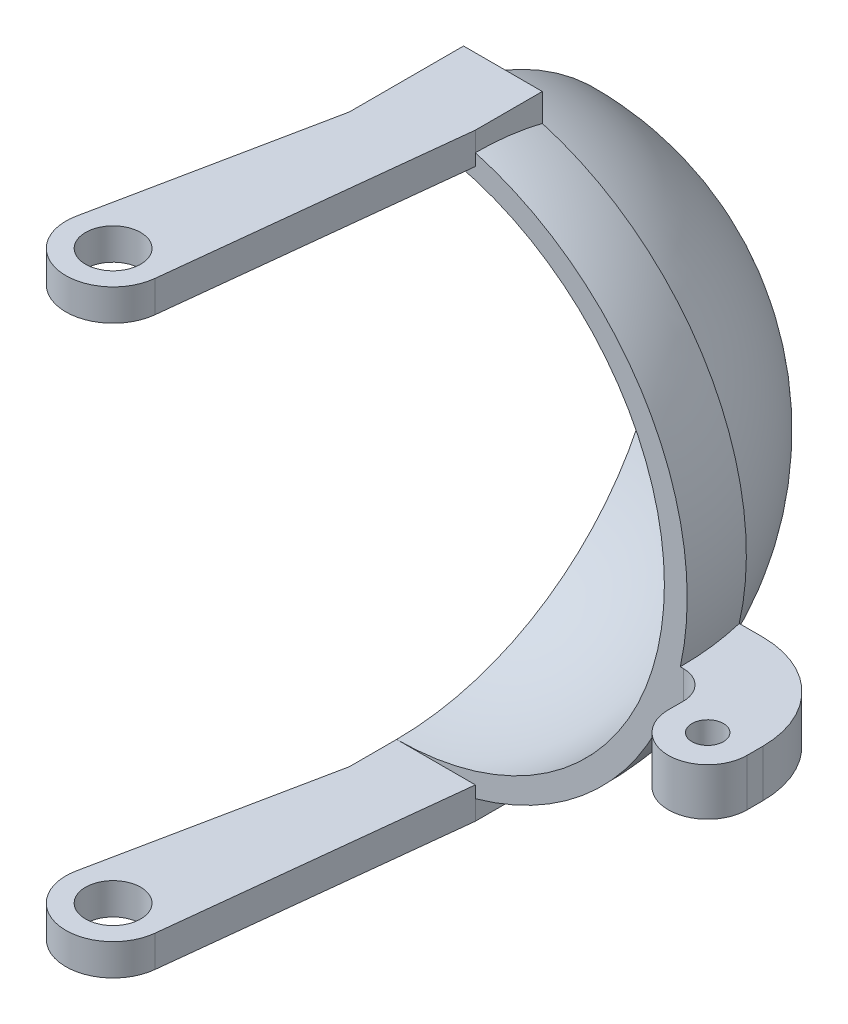
ISO-10303-21;
HEADER;
FILE_DESCRIPTION(('STEP AP214'),'2;1');
FILE_NAME('part.step','',(''),(''),'','','');
FILE_SCHEMA(('AUTOMOTIVE_DESIGN { 1 0 10303 214 1 1 1 1 }'));
ENDSEC;
DATA;
#1=APPLICATION_CONTEXT('core data for automotive mechanical design processes');
#2=APPLICATION_PROTOCOL_DEFINITION('international standard','automotive_design',2000,#1);
#3=PRODUCT_CONTEXT('',#1,'mechanical');
#4=PRODUCT('Part','Part','',(#3));
#5=PRODUCT_RELATED_PRODUCT_CATEGORY('part','',(#4));
#6=PRODUCT_DEFINITION_FORMATION('','',#4);
#7=PRODUCT_DEFINITION_CONTEXT('part definition',#1,'design');
#8=PRODUCT_DEFINITION('design','',#6,#7);
#9=PRODUCT_DEFINITION_SHAPE('','',#8);
#10=(LENGTH_UNIT() NAMED_UNIT(*) SI_UNIT(.MILLI.,.METRE.));
#11=(NAMED_UNIT(*) PLANE_ANGLE_UNIT() SI_UNIT($,.RADIAN.));
#12=(NAMED_UNIT(*) SI_UNIT($,.STERADIAN.) SOLID_ANGLE_UNIT());
#13=UNCERTAINTY_MEASURE_WITH_UNIT(LENGTH_MEASURE(1.E-05),#10,'distance_accuracy_value','');
#14=(GEOMETRIC_REPRESENTATION_CONTEXT(3) GLOBAL_UNCERTAINTY_ASSIGNED_CONTEXT((#13)) GLOBAL_UNIT_ASSIGNED_CONTEXT((#10,
#11,#12)) REPRESENTATION_CONTEXT('',''));
#15=CARTESIAN_POINT('',(0.,0.,0.));
#16=DIRECTION('',(0.,0.,1.));
#17=DIRECTION('',(1.,0.,0.));
#18=AXIS2_PLACEMENT_3D('',#15,#16,#17);
#19=CARTESIAN_POINT('',(0.,0.,0.));
#20=DIRECTION('',(0.,0.,1.));
#21=DIRECTION('',(0.,-1.,0.));
#22=AXIS2_PLACEMENT_3D('',#19,#20,#21);
#23=SPHERICAL_SURFACE('',#22,18.45);
#24=CARTESIAN_POINT('',(0.,0.,-4.25));
#25=DIRECTION('',(0.,0.,1.));
#26=DIRECTION('',(1.,0.,0.));
#27=AXIS2_PLACEMENT_3D('',#24,#25,#26);
#28=CIRCLE('',#27,17.9538296750303);
#29=CARTESIAN_POINT('',(5.,-17.2435495185881,-4.25));
#30=VERTEX_POINT('',#29);
#31=CARTESIAN_POINT('',(16.5329973084133,-7.,-4.25));
#32=VERTEX_POINT('',#31);
#33=EDGE_CURVE('E365',#30,#32,#28,.T.);
#34=ORIENTED_EDGE('',*,*,#33,.T.);
#35=CARTESIAN_POINT('',(0.,-7.,0.));
#36=DIRECTION('',(0.,-1.,0.));
#37=DIRECTION('',(0.,0.,-1.));
#38=AXIS2_PLACEMENT_3D('',#35,#36,#37);
#39=CIRCLE('',#38,17.0705155165273);
#40=CARTESIAN_POINT('',(17.0705155165273,-7.,0.));
#41=VERTEX_POINT('',#40);
#42=EDGE_CURVE('E238',#41,#32,#39,.F.);
#43=ORIENTED_EDGE('',*,*,#42,.F.);
#44=CARTESIAN_POINT('',(0.,0.,0.));
#45=DIRECTION('',(0.,0.,1.));
#46=DIRECTION('',(1.,0.,0.));
#47=AXIS2_PLACEMENT_3D('',#44,#45,#46);
#48=CIRCLE('',#47,18.45);
#49=CARTESIAN_POINT('',(5.,-17.7595748822994,0.));
#50=VERTEX_POINT('',#49);
#51=EDGE_CURVE('E371',#50,#41,#48,.T.);
#52=ORIENTED_EDGE('',*,*,#51,.F.);
#53=CARTESIAN_POINT('',(5.,0.,0.));
#54=DIRECTION('',(-1.,0.,0.));
#55=DIRECTION('',(0.,0.,1.));
#56=AXIS2_PLACEMENT_3D('',#53,#54,#55);
#57=CIRCLE('',#56,17.7595748822994);
#58=EDGE_CURVE('E348',#50,#30,#57,.F.);
#59=ORIENTED_EDGE('',*,*,#58,.T.);
#60=EDGE_LOOP('',(#34,#43,#52,#59));
#61=FACE_BOUND('',#60,.T.);
#62=ADVANCED_FACE('F43',(#61),#23,.T.);
#63=CARTESIAN_POINT('',(0.,0.,0.));
#64=DIRECTION('',(0.,0.,1.));
#65=DIRECTION('',(1.,0.,0.));
#66=AXIS2_PLACEMENT_3D('',#63,#64,#65);
#67=PLANE('',#66);
#68=DIRECTION('',(1.,0.,0.));
#69=VECTOR('',#68,1.);
#70=CARTESIAN_POINT('',(-18.451,-7.,0.));
#71=LINE('',#70,#69);
#72=CARTESIAN_POINT('',(18.2,-7.,0.));
#73=VERTEX_POINT('',#72);
#74=EDGE_CURVE('E232',#41,#73,#71,.T.);
#75=ORIENTED_EDGE('',*,*,#74,.T.);
#76=DIRECTION('',(0.,-1.,0.));
#77=VECTOR('',#76,1.);
#78=CARTESIAN_POINT('',(18.2,0.,0.));
#79=LINE('',#78,#77);
#80=CARTESIAN_POINT('',(18.2,-4.,0.));
#81=VERTEX_POINT('',#80);
#82=EDGE_CURVE('E58',#73,#81,#79,.F.);
#83=ORIENTED_EDGE('',*,*,#82,.T.);
#84=DIRECTION('',(1.,0.,0.));
#85=VECTOR('',#84,1.);
#86=CARTESIAN_POINT('',(-18.451,-4.,0.));
#87=LINE('',#86,#85);
#88=CARTESIAN_POINT('',(18.0111770853545,-4.,0.));
#89=VERTEX_POINT('',#88);
#90=EDGE_CURVE('E239',#89,#81,#87,.T.);
#91=ORIENTED_EDGE('',*,*,#90,.F.);
#92=CARTESIAN_POINT('',(5.,17.7595748822994,0.));
#93=VERTEX_POINT('',#92);
#94=EDGE_CURVE('E370',#89,#93,#48,.T.);
#95=ORIENTED_EDGE('',*,*,#94,.T.);
#96=DIRECTION('',(0.,1.,0.));
#97=VECTOR('',#96,1.);
#98=CARTESIAN_POINT('',(5.,17.,0.));
#99=LINE('',#98,#97);
#100=CARTESIAN_POINT('',(5.,17.,0.));
#101=VERTEX_POINT('',#100);
#102=EDGE_CURVE('E284',#101,#93,#99,.T.);
#103=ORIENTED_EDGE('',*,*,#102,.F.);
#104=DIRECTION('',(1.,0.,0.));
#105=VECTOR('',#104,1.);
#106=CARTESIAN_POINT('',(5.,17.,0.));
#107=LINE('',#106,#105);
#108=CARTESIAN_POINT('',(0.,17.,0.));
#109=VERTEX_POINT('',#108);
#110=EDGE_CURVE('E262',#109,#101,#107,.T.);
#111=ORIENTED_EDGE('',*,*,#110,.F.);
#112=CARTESIAN_POINT('',(0.,0.,0.));
#113=DIRECTION('',(0.,0.,-1.));
#114=DIRECTION('',(1.,0.,0.));
#115=AXIS2_PLACEMENT_3D('',#112,#113,#114);
#116=CIRCLE('',#115,17.);
#117=CARTESIAN_POINT('',(0.,-17.,0.));
#118=VERTEX_POINT('',#117);
#119=EDGE_CURVE('E379',#109,#118,#116,.T.);
#120=ORIENTED_EDGE('',*,*,#119,.T.);
#121=DIRECTION('',(1.,0.,0.));
#122=VECTOR('',#121,1.);
#123=CARTESIAN_POINT('',(5.,-17.,0.));
#124=LINE('',#123,#122);
#125=CARTESIAN_POINT('',(5.,-17.,0.));
#126=VERTEX_POINT('',#125);
#127=EDGE_CURVE('E321',#118,#126,#124,.T.);
#128=ORIENTED_EDGE('',*,*,#127,.T.);
#129=DIRECTION('',(0.,-1.,0.));
#130=VECTOR('',#129,1.);
#131=CARTESIAN_POINT('',(5.,-17.,0.));
#132=LINE('',#131,#130);
#133=EDGE_CURVE('E338',#126,#50,#132,.T.);
#134=ORIENTED_EDGE('',*,*,#133,.T.);
#135=ORIENTED_EDGE('',*,*,#51,.T.);
#136=EDGE_LOOP('',(#75,#83,#91,#95,#103,#111,#120,#128,#134,#135));
#137=FACE_BOUND('',#136,.T.);
#138=ADVANCED_FACE('F410',(#137),#67,.T.);
#139=ORIENTED_EDGE('',*,*,#94,.F.);
#140=CARTESIAN_POINT('',(0.,-4.,0.));
#141=DIRECTION('',(0.,1.,0.));
#142=DIRECTION('',(0.,0.,1.));
#143=AXIS2_PLACEMENT_3D('',#140,#141,#142);
#144=CIRCLE('',#143,18.0111770853545);
#145=CARTESIAN_POINT('',(17.5025712396779,-4.,-4.25));
#146=VERTEX_POINT('',#145);
#147=EDGE_CURVE('E234',#146,#89,#144,.F.);
#148=ORIENTED_EDGE('',*,*,#147,.F.);
#149=CARTESIAN_POINT('',(5.,17.2435495185881,-4.25));
#150=VERTEX_POINT('',#149);
#151=EDGE_CURVE('E364',#146,#150,#28,.T.);
#152=ORIENTED_EDGE('',*,*,#151,.T.);
#153=CARTESIAN_POINT('',(5.,0.,0.));
#154=DIRECTION('',(1.,0.,0.));
#155=DIRECTION('',(0.,0.,-1.));
#156=AXIS2_PLACEMENT_3D('',#153,#154,#155);
#157=CIRCLE('',#156,17.7595748822994);
#158=EDGE_CURVE('E289',#93,#150,#157,.F.);
#159=ORIENTED_EDGE('',*,*,#158,.F.);
#160=EDGE_LOOP('',(#139,#148,#152,#159));
#161=FACE_BOUND('',#160,.T.);
#162=ADVANCED_FACE('F443',(#161),#23,.T.);
#163=CARTESIAN_POINT('',(0.,0.,0.));
#164=DIRECTION('',(0.,1.,0.));
#165=DIRECTION('',(-1.,0.,0.));
#166=AXIS2_PLACEMENT_3D('',#163,#164,#165);
#167=SPHERICAL_SURFACE('',#166,17.75);
#168=CARTESIAN_POINT('',(0.,0.,-4.25));
#169=DIRECTION('',(0.,0.,1.));
#170=DIRECTION('',(1.,0.,0.));
#171=AXIS2_PLACEMENT_3D('',#168,#169,#170);
#172=CIRCLE('',#171,17.2336879396141);
#173=CARTESIAN_POINT('',(-1.20342199681217E-13,-17.2336879396141,-4.25));
#174=VERTEX_POINT('',#173);
#175=CARTESIAN_POINT('',(0.,17.2336879396141,-4.25));
#176=VERTEX_POINT('',#175);
#177=EDGE_CURVE('E367',#174,#176,#172,.T.);
#178=ORIENTED_EDGE('',*,*,#177,.F.);
#179=CARTESIAN_POINT('',(0.,0.,0.));
#180=DIRECTION('',(1.,0.,0.));
#181=DIRECTION('',(0.,0.,-1.));
#182=AXIS2_PLACEMENT_3D('',#179,#180,#181);
#183=CIRCLE('',#182,17.75);
#184=EDGE_CURVE('E377',#174,#176,#183,.T.);
#185=ORIENTED_EDGE('',*,*,#184,.T.);
#186=EDGE_LOOP('',(#178,#185));
#187=FACE_BOUND('',#186,.T.);
#188=ADVANCED_FACE('F440',(#187),#167,.T.);
#189=CARTESIAN_POINT('',(0.,0.,0.));
#190=DIRECTION('',(0.,1.,0.));
#191=DIRECTION('',(1.,0.,0.));
#192=AXIS2_PLACEMENT_3D('',#189,#190,#191);
#193=SPHERICAL_SURFACE('',#192,17.);
#194=CARTESIAN_POINT('',(0.,0.,0.));
#195=DIRECTION('',(-1.,0.,0.));
#196=DIRECTION('',(0.,0.,-1.));
#197=AXIS2_PLACEMENT_3D('',#194,#195,#196);
#198=CIRCLE('',#197,17.);
#199=EDGE_CURVE('E374',#109,#118,#198,.T.);
#200=ORIENTED_EDGE('',*,*,#199,.T.);
#201=ORIENTED_EDGE('',*,*,#119,.F.);
#202=EDGE_LOOP('',(#200,#201));
#203=FACE_BOUND('',#202,.T.);
#204=ADVANCED_FACE('F442',(#203),#193,.F.);
#205=CARTESIAN_POINT('',(0.,0.,0.));
#206=DIRECTION('',(1.,0.,0.));
#207=DIRECTION('',(0.,0.,-1.));
#208=AXIS2_PLACEMENT_3D('',#205,#206,#207);
#209=PLANE('',#208);
#210=ORIENTED_EDGE('',*,*,#199,.F.);
#211=DIRECTION('',(0.,0.,-1.));
#212=VECTOR('',#211,1.);
#213=CARTESIAN_POINT('',(0.,17.,0.));
#214=LINE('',#213,#212);
#215=CARTESIAN_POINT('',(0.,17.,3.));
#216=VERTEX_POINT('',#215);
#217=EDGE_CURVE('E265',#216,#109,#214,.T.);
#218=ORIENTED_EDGE('',*,*,#217,.F.);
#219=DIRECTION('',(0.,1.,0.));
#220=VECTOR('',#219,1.);
#221=CARTESIAN_POINT('',(0.,17.,3.));
#222=LINE('',#221,#220);
#223=CARTESIAN_POINT('',(0.,19.,3.));
#224=VERTEX_POINT('',#223);
#225=EDGE_CURVE('E281',#216,#224,#222,.T.);
#226=ORIENTED_EDGE('',*,*,#225,.T.);
#227=DIRECTION('',(0.,0.,1.));
#228=VECTOR('',#227,1.);
#229=CARTESIAN_POINT('',(0.,19.,0.));
#230=LINE('',#229,#228);
#231=CARTESIAN_POINT('',(0.,19.,-4.25));
#232=VERTEX_POINT('',#231);
#233=EDGE_CURVE('E280',#232,#224,#230,.T.);
#234=ORIENTED_EDGE('',*,*,#233,.F.);
#235=DIRECTION('',(0.,1.,0.));
#236=VECTOR('',#235,1.);
#237=CARTESIAN_POINT('',(0.,17.9538296750303,-4.25));
#238=LINE('',#237,#236);
#239=EDGE_CURVE('E357',#176,#232,#238,.T.);
#240=ORIENTED_EDGE('',*,*,#239,.F.);
#241=ORIENTED_EDGE('',*,*,#184,.F.);
#242=DIRECTION('',(0.,-1.,0.));
#243=VECTOR('',#242,1.);
#244=CARTESIAN_POINT('',(-1.25370922542273E-13,-17.9538296750303,-4.25));
#245=LINE('',#244,#243);
#246=CARTESIAN_POINT('',(0.,-19.,-4.25));
#247=VERTEX_POINT('',#246);
#248=EDGE_CURVE('E362',#174,#247,#245,.T.);
#249=ORIENTED_EDGE('',*,*,#248,.T.);
#250=DIRECTION('',(0.,0.,1.));
#251=VECTOR('',#250,1.);
#252=CARTESIAN_POINT('',(0.,-19.,0.));
#253=LINE('',#252,#251);
#254=CARTESIAN_POINT('',(0.,-19.,3.));
#255=VERTEX_POINT('',#254);
#256=EDGE_CURVE('E337',#247,#255,#253,.T.);
#257=ORIENTED_EDGE('',*,*,#256,.T.);
#258=DIRECTION('',(0.,-1.,0.));
#259=VECTOR('',#258,1.);
#260=CARTESIAN_POINT('',(0.,-17.,3.));
#261=LINE('',#260,#259);
#262=CARTESIAN_POINT('',(0.,-17.,3.));
#263=VERTEX_POINT('',#262);
#264=EDGE_CURVE('E341',#263,#255,#261,.T.);
#265=ORIENTED_EDGE('',*,*,#264,.F.);
#266=DIRECTION('',(0.,0.,-1.));
#267=VECTOR('',#266,1.);
#268=CARTESIAN_POINT('',(0.,-17.,0.));
#269=LINE('',#268,#267);
#270=EDGE_CURVE('E318',#263,#118,#269,.T.);
#271=ORIENTED_EDGE('',*,*,#270,.T.);
#272=EDGE_LOOP('',(#210,#218,#226,#234,#240,#241,#249,#257,#265,#271));
#273=FACE_BOUND('',#272,.T.);
#274=ADVANCED_FACE('F437',(#273),#209,.F.);
#275=CARTESIAN_POINT('',(-1.25370922542273E-13,-17.9538296750303,-4.25));
#276=DIRECTION('',(0.,0.,1.));
#277=DIRECTION('',(1.,0.,0.));
#278=AXIS2_PLACEMENT_3D('',#275,#276,#277);
#279=PLANE('',#278);
#280=DIRECTION('',(1.,0.,0.));
#281=VECTOR('',#280,1.);
#282=CARTESIAN_POINT('',(-18.451,-4.,-4.25));
#283=LINE('',#282,#281);
#284=CARTESIAN_POINT('',(19.,-4.,-4.25));
#285=VERTEX_POINT('',#284);
#286=EDGE_CURVE('E241',#146,#285,#283,.T.);
#287=ORIENTED_EDGE('',*,*,#286,.T.);
#288=DIRECTION('',(0.,-1.,0.));
#289=VECTOR('',#288,1.);
#290=CARTESIAN_POINT('',(19.,-17.9538296750303,-4.25));
#291=LINE('',#290,#289);
#292=CARTESIAN_POINT('',(19.,-7.,-4.25));
#293=VERTEX_POINT('',#292);
#294=EDGE_CURVE('E382',#285,#293,#291,.T.);
#295=ORIENTED_EDGE('',*,*,#294,.T.);
#296=DIRECTION('',(1.,0.,0.));
#297=VECTOR('',#296,1.);
#298=CARTESIAN_POINT('',(-18.451,-7.,-4.25));
#299=LINE('',#298,#297);
#300=EDGE_CURVE('E244',#32,#293,#299,.T.);
#301=ORIENTED_EDGE('',*,*,#300,.F.);
#302=ORIENTED_EDGE('',*,*,#33,.F.);
#303=DIRECTION('',(0.,-1.,0.));
#304=VECTOR('',#303,1.);
#305=CARTESIAN_POINT('',(5.,18.451,-4.25));
#306=LINE('',#305,#304);
#307=CARTESIAN_POINT('',(5.,-19.,-4.25));
#308=VERTEX_POINT('',#307);
#309=EDGE_CURVE('E349',#30,#308,#306,.T.);
#310=ORIENTED_EDGE('',*,*,#309,.T.);
#311=DIRECTION('',(-1.,0.,0.));
#312=VECTOR('',#311,1.);
#313=CARTESIAN_POINT('',(0.,-19.,-4.25));
#314=LINE('',#313,#312);
#315=EDGE_CURVE('E345',#308,#247,#314,.T.);
#316=ORIENTED_EDGE('',*,*,#315,.T.);
#317=ORIENTED_EDGE('',*,*,#248,.F.);
#318=ORIENTED_EDGE('',*,*,#177,.T.);
#319=ORIENTED_EDGE('',*,*,#239,.T.);
#320=DIRECTION('',(-1.,0.,0.));
#321=VECTOR('',#320,1.);
#322=CARTESIAN_POINT('',(0.,19.,-4.25));
#323=LINE('',#322,#321);
#324=CARTESIAN_POINT('',(5.,19.,-4.25));
#325=VERTEX_POINT('',#324);
#326=EDGE_CURVE('E295',#325,#232,#323,.T.);
#327=ORIENTED_EDGE('',*,*,#326,.F.);
#328=DIRECTION('',(0.,1.,0.));
#329=VECTOR('',#328,1.);
#330=CARTESIAN_POINT('',(5.,-19.001,-4.25));
#331=LINE('',#330,#329);
#332=EDGE_CURVE('E293',#150,#325,#331,.T.);
#333=ORIENTED_EDGE('',*,*,#332,.F.);
#334=ORIENTED_EDGE('',*,*,#151,.F.);
#335=EDGE_LOOP('',(#287,#295,#301,#302,#310,#316,#317,#318,#319,#327,#333,#334));
#336=FACE_BOUND('',#335,.T.);
#337=ADVANCED_FACE('F406',(#336),#279,.F.);
#338=CARTESIAN_POINT('',(5.,18.451,0.));
#339=DIRECTION('',(-1.,0.,0.));
#340=DIRECTION('',(0.,0.,1.));
#341=AXIS2_PLACEMENT_3D('',#338,#339,#340);
#342=PLANE('',#341);
#343=ORIENTED_EDGE('',*,*,#58,.F.);
#344=DIRECTION('',(0.,-1.,0.));
#345=VECTOR('',#344,1.);
#346=CARTESIAN_POINT('',(5.,18.451,0.));
#347=LINE('',#346,#345);
#348=CARTESIAN_POINT('',(5.,-19.,0.));
#349=VERTEX_POINT('',#348);
#350=EDGE_CURVE('E353',#50,#349,#347,.T.);
#351=ORIENTED_EDGE('',*,*,#350,.T.);
#352=DIRECTION('',(0.,0.,-1.));
#353=VECTOR('',#352,1.);
#354=CARTESIAN_POINT('',(5.,-19.,0.));
#355=LINE('',#354,#353);
#356=EDGE_CURVE('E350',#349,#308,#355,.T.);
#357=ORIENTED_EDGE('',*,*,#356,.T.);
#358=ORIENTED_EDGE('',*,*,#309,.F.);
#359=EDGE_LOOP('',(#343,#351,#357,#358));
#360=FACE_BOUND('',#359,.T.);
#361=ADVANCED_FACE('F426',(#360),#342,.F.);
#362=CARTESIAN_POINT('',(0.,-19.,0.));
#363=DIRECTION('',(0.,-1.,0.));
#364=DIRECTION('',(0.,0.,-1.));
#365=AXIS2_PLACEMENT_3D('',#362,#363,#364);
#366=PLANE('',#365);
#367=ORIENTED_EDGE('',*,*,#256,.F.);
#368=ORIENTED_EDGE('',*,*,#315,.F.);
#369=ORIENTED_EDGE('',*,*,#356,.F.);
#370=DIRECTION('',(-0.109442534592919,0.,0.99399312453451));
#371=VECTOR('',#370,1.);
#372=CARTESIAN_POINT('',(2.98197937360353,-19.,18.3283276037788));
#373=LINE('',#372,#371);
#374=CARTESIAN_POINT('',(2.98197937360353,-19.,18.3283276037788));
#375=VERTEX_POINT('',#374);
#376=EDGE_CURVE('E315',#349,#375,#373,.T.);
#377=ORIENTED_EDGE('',*,*,#376,.T.);
#378=CARTESIAN_POINT('',(0.,-19.,18.));
#379=DIRECTION('',(0.,-1.,0.));
#380=DIRECTION('',(0.,0.,-1.));
#381=AXIS2_PLACEMENT_3D('',#378,#379,#380);
#382=CIRCLE('',#381,3.);
#383=CARTESIAN_POINT('',(-2.93938769133981,-19.,17.4));
#384=VERTEX_POINT('',#383);
#385=EDGE_CURVE('E308',#375,#384,#382,.T.);
#386=ORIENTED_EDGE('',*,*,#385,.T.);
#387=DIRECTION('',(0.2,0.,-0.979795897113271));
#388=VECTOR('',#387,1.);
#389=CARTESIAN_POINT('',(0.,-19.,3.));
#390=LINE('',#389,#388);
#391=EDGE_CURVE('E330',#384,#255,#390,.T.);
#392=ORIENTED_EDGE('',*,*,#391,.T.);
#393=EDGE_LOOP('',(#367,#368,#369,#377,#386,#392));
#394=FACE_BOUND('',#393,.T.);
#395=CARTESIAN_POINT('',(0.,-19.,18.));
#396=DIRECTION('',(0.,-1.,0.));
#397=DIRECTION('',(0.,0.,-1.));
#398=AXIS2_PLACEMENT_3D('',#395,#396,#397);
#399=CIRCLE('',#398,1.75);
#400=CARTESIAN_POINT('',(0.,-19.,16.25));
#401=VERTEX_POINT('',#400);
#402=EDGE_CURVE('E292',#401,#401,#399,.T.);
#403=ORIENTED_EDGE('',*,*,#402,.F.);
#404=EDGE_LOOP('',(#403));
#405=FACE_BOUND('',#404,.T.);
#406=ADVANCED_FACE('F430',(#394,#405),#366,.T.);
#407=CARTESIAN_POINT('',(0.,-17.,18.));
#408=DIRECTION('',(0.,-1.,0.));
#409=DIRECTION('',(0.,0.,-1.));
#410=AXIS2_PLACEMENT_3D('',#407,#408,#409);
#411=CYLINDRICAL_SURFACE('',#410,3.);
#412=ORIENTED_EDGE('',*,*,#385,.F.);
#413=DIRECTION('',(0.,-1.,0.));
#414=VECTOR('',#413,1.);
#415=CARTESIAN_POINT('',(2.98197937360353,-17.,18.3283276037788));
#416=LINE('',#415,#414);
#417=CARTESIAN_POINT('',(2.98197937360353,-17.,18.3283276037788));
#418=VERTEX_POINT('',#417);
#419=EDGE_CURVE('E335',#418,#375,#416,.T.);
#420=ORIENTED_EDGE('',*,*,#419,.F.);
#421=CARTESIAN_POINT('',(0.,-17.,18.));
#422=DIRECTION('',(0.,-1.,0.));
#423=DIRECTION('',(0.,0.,-1.));
#424=AXIS2_PLACEMENT_3D('',#421,#422,#423);
#425=CIRCLE('',#424,3.);
#426=CARTESIAN_POINT('',(-2.93938769133981,-17.,17.4));
#427=VERTEX_POINT('',#426);
#428=EDGE_CURVE('E311',#418,#427,#425,.T.);
#429=ORIENTED_EDGE('',*,*,#428,.T.);
#430=DIRECTION('',(0.,-1.,0.));
#431=VECTOR('',#430,1.);
#432=CARTESIAN_POINT('',(-2.93938769133981,-17.,17.4));
#433=LINE('',#432,#431);
#434=EDGE_CURVE('E327',#427,#384,#433,.T.);
#435=ORIENTED_EDGE('',*,*,#434,.T.);
#436=EDGE_LOOP('',(#412,#420,#429,#435));
#437=FACE_BOUND('',#436,.T.);
#438=ADVANCED_FACE('F421',(#437),#411,.T.);
#439=CARTESIAN_POINT('',(2.98197937360353,-17.,18.3283276037788));
#440=DIRECTION('',(0.99399312453451,0.,0.109442534592919));
#441=DIRECTION('',(0.109442534592919,0.,-0.99399312453451));
#442=AXIS2_PLACEMENT_3D('',#439,#440,#441);
#443=PLANE('',#442);
#444=ORIENTED_EDGE('',*,*,#376,.F.);
#445=ORIENTED_EDGE('',*,*,#350,.F.);
#446=ORIENTED_EDGE('',*,*,#133,.F.);
#447=DIRECTION('',(-0.109442534592919,0.,0.99399312453451));
#448=VECTOR('',#447,1.);
#449=CARTESIAN_POINT('',(2.98197937360353,-17.,18.3283276037788));
#450=LINE('',#449,#448);
#451=EDGE_CURVE('E324',#126,#418,#450,.T.);
#452=ORIENTED_EDGE('',*,*,#451,.T.);
#453=ORIENTED_EDGE('',*,*,#419,.T.);
#454=EDGE_LOOP('',(#444,#445,#446,#452,#453));
#455=FACE_BOUND('',#454,.T.);
#456=ADVANCED_FACE('F413',(#455),#443,.T.);
#457=CARTESIAN_POINT('',(0.,-17.,3.));
#458=DIRECTION('',(-0.979795897113271,0.,-0.2));
#459=DIRECTION('',(-0.2,0.,0.979795897113271));
#460=AXIS2_PLACEMENT_3D('',#457,#458,#459);
#461=PLANE('',#460);
#462=ORIENTED_EDGE('',*,*,#391,.F.);
#463=ORIENTED_EDGE('',*,*,#434,.F.);
#464=DIRECTION('',(0.2,0.,-0.979795897113271));
#465=VECTOR('',#464,1.);
#466=CARTESIAN_POINT('',(0.,-17.,3.));
#467=LINE('',#466,#465);
#468=EDGE_CURVE('E314',#427,#263,#467,.T.);
#469=ORIENTED_EDGE('',*,*,#468,.T.);
#470=ORIENTED_EDGE('',*,*,#264,.T.);
#471=EDGE_LOOP('',(#462,#463,#469,#470));
#472=FACE_BOUND('',#471,.T.);
#473=ADVANCED_FACE('F637',(#472),#461,.T.);
#474=CARTESIAN_POINT('',(0.,-17.,18.));
#475=DIRECTION('',(0.,-1.,0.));
#476=DIRECTION('',(0.,0.,-1.));
#477=AXIS2_PLACEMENT_3D('',#474,#475,#476);
#478=PLANE('',#477);
#479=CARTESIAN_POINT('',(0.,-17.,18.));
#480=DIRECTION('',(0.,-1.,0.));
#481=DIRECTION('',(0.,0.,-1.));
#482=AXIS2_PLACEMENT_3D('',#479,#480,#481);
#483=CIRCLE('',#482,1.75);
#484=CARTESIAN_POINT('',(0.,-17.,16.25));
#485=VERTEX_POINT('',#484);
#486=EDGE_CURVE('E305',#485,#485,#483,.T.);
#487=ORIENTED_EDGE('',*,*,#486,.T.);
#488=EDGE_LOOP('',(#487));
#489=FACE_BOUND('',#488,.T.);
#490=ORIENTED_EDGE('',*,*,#428,.F.);
#491=ORIENTED_EDGE('',*,*,#451,.F.);
#492=ORIENTED_EDGE('',*,*,#127,.F.);
#493=ORIENTED_EDGE('',*,*,#270,.F.);
#494=ORIENTED_EDGE('',*,*,#468,.F.);
#495=EDGE_LOOP('',(#490,#491,#492,#493,#494));
#496=FACE_BOUND('',#495,.T.);
#497=ADVANCED_FACE('F416',(#489,#496),#478,.F.);
#498=CARTESIAN_POINT('',(0.,-17.,18.));
#499=DIRECTION('',(0.,-1.,0.));
#500=DIRECTION('',(0.,0.,-1.));
#501=AXIS2_PLACEMENT_3D('',#498,#499,#500);
#502=CYLINDRICAL_SURFACE('',#501,1.75);
#503=ORIENTED_EDGE('',*,*,#486,.F.);
#504=EDGE_LOOP('',(#503));
#505=FACE_BOUND('',#504,.T.);
#506=ORIENTED_EDGE('',*,*,#402,.T.);
#507=EDGE_LOOP('',(#506));
#508=FACE_BOUND('',#507,.T.);
#509=ADVANCED_FACE('F481',(#505,#508),#502,.F.);
#510=CARTESIAN_POINT('',(0.,19.,0.));
#511=DIRECTION('',(0.,1.,0.));
#512=DIRECTION('',(0.,0.,-1.));
#513=AXIS2_PLACEMENT_3D('',#510,#511,#512);
#514=PLANE('',#513);
#515=ORIENTED_EDGE('',*,*,#233,.T.);
#516=DIRECTION('',(0.2,0.,-0.979795897113271));
#517=VECTOR('',#516,1.);
#518=CARTESIAN_POINT('',(0.,19.,3.));
#519=LINE('',#518,#517);
#520=CARTESIAN_POINT('',(-2.93938769133981,19.,17.4));
#521=VERTEX_POINT('',#520);
#522=EDGE_CURVE('E260',#521,#224,#519,.T.);
#523=ORIENTED_EDGE('',*,*,#522,.F.);
#524=CARTESIAN_POINT('',(0.,19.,18.));
#525=DIRECTION('',(0.,-1.,0.));
#526=DIRECTION('',(0.,0.,-1.));
#527=AXIS2_PLACEMENT_3D('',#524,#525,#526);
#528=CIRCLE('',#527,3.);
#529=CARTESIAN_POINT('',(2.98197937360353,19.,18.3283276037788));
#530=VERTEX_POINT('',#529);
#531=EDGE_CURVE('E253',#530,#521,#528,.T.);
#532=ORIENTED_EDGE('',*,*,#531,.F.);
#533=DIRECTION('',(-0.109442534592919,0.,0.99399312453451));
#534=VECTOR('',#533,1.);
#535=CARTESIAN_POINT('',(2.98197937360353,19.,18.3283276037788));
#536=LINE('',#535,#534);
#537=CARTESIAN_POINT('',(5.,19.,0.));
#538=VERTEX_POINT('',#537);
#539=EDGE_CURVE('E273',#538,#530,#536,.T.);
#540=ORIENTED_EDGE('',*,*,#539,.F.);
#541=DIRECTION('',(0.,0.,-1.));
#542=VECTOR('',#541,1.);
#543=CARTESIAN_POINT('',(5.,19.,0.));
#544=LINE('',#543,#542);
#545=EDGE_CURVE('E298',#538,#325,#544,.T.);
#546=ORIENTED_EDGE('',*,*,#545,.T.);
#547=ORIENTED_EDGE('',*,*,#326,.T.);
#548=EDGE_LOOP('',(#515,#523,#532,#540,#546,#547));
#549=FACE_BOUND('',#548,.T.);
#550=CARTESIAN_POINT('',(0.,19.,18.));
#551=DIRECTION('',(0.,-1.,0.));
#552=DIRECTION('',(0.,0.,-1.));
#553=AXIS2_PLACEMENT_3D('',#550,#551,#552);
#554=CIRCLE('',#553,1.75);
#555=CARTESIAN_POINT('',(0.,19.,16.25));
#556=VERTEX_POINT('',#555);
#557=EDGE_CURVE('E237',#556,#556,#554,.T.);
#558=ORIENTED_EDGE('',*,*,#557,.T.);
#559=EDGE_LOOP('',(#558));
#560=FACE_BOUND('',#559,.T.);
#561=ADVANCED_FACE('F477',(#549,#560),#514,.T.);
#562=CARTESIAN_POINT('',(5.,-19.001,0.));
#563=DIRECTION('',(1.,0.,0.));
#564=DIRECTION('',(0.,0.,-1.));
#565=AXIS2_PLACEMENT_3D('',#562,#563,#564);
#566=PLANE('',#565);
#567=DIRECTION('',(0.,1.,0.));
#568=VECTOR('',#567,1.);
#569=CARTESIAN_POINT('',(5.,-19.001,0.));
#570=LINE('',#569,#568);
#571=EDGE_CURVE('E301',#93,#538,#570,.T.);
#572=ORIENTED_EDGE('',*,*,#571,.F.);
#573=ORIENTED_EDGE('',*,*,#158,.T.);
#574=ORIENTED_EDGE('',*,*,#332,.T.);
#575=ORIENTED_EDGE('',*,*,#545,.F.);
#576=EDGE_LOOP('',(#572,#573,#574,#575));
#577=FACE_BOUND('',#576,.T.);
#578=ADVANCED_FACE('F480',(#577),#566,.T.);
#579=CARTESIAN_POINT('',(0.,17.,18.));
#580=DIRECTION('',(0.,1.,0.));
#581=DIRECTION('',(0.,0.,-1.));
#582=AXIS2_PLACEMENT_3D('',#579,#580,#581);
#583=PLANE('',#582);
#584=CARTESIAN_POINT('',(0.,17.,18.));
#585=DIRECTION('',(0.,-1.,0.));
#586=DIRECTION('',(0.,0.,-1.));
#587=AXIS2_PLACEMENT_3D('',#584,#585,#586);
#588=CIRCLE('',#587,3.);
#589=CARTESIAN_POINT('',(2.98197937360353,17.,18.3283276037788));
#590=VERTEX_POINT('',#589);
#591=CARTESIAN_POINT('',(-2.93938769133981,17.,17.4));
#592=VERTEX_POINT('',#591);
#593=EDGE_CURVE('E256',#590,#592,#588,.T.);
#594=ORIENTED_EDGE('',*,*,#593,.T.);
#595=DIRECTION('',(0.2,0.,-0.979795897113271));
#596=VECTOR('',#595,1.);
#597=CARTESIAN_POINT('',(0.,17.,3.));
#598=LINE('',#597,#596);
#599=EDGE_CURVE('E268',#592,#216,#598,.T.);
#600=ORIENTED_EDGE('',*,*,#599,.T.);
#601=ORIENTED_EDGE('',*,*,#217,.T.);
#602=ORIENTED_EDGE('',*,*,#110,.T.);
#603=DIRECTION('',(-0.109442534592919,0.,0.99399312453451));
#604=VECTOR('',#603,1.);
#605=CARTESIAN_POINT('',(2.98197937360353,17.,18.3283276037788));
#606=LINE('',#605,#604);
#607=EDGE_CURVE('E259',#101,#590,#606,.T.);
#608=ORIENTED_EDGE('',*,*,#607,.T.);
#609=EDGE_LOOP('',(#594,#600,#601,#602,#608));
#610=FACE_BOUND('',#609,.T.);
#611=CARTESIAN_POINT('',(0.,17.,18.));
#612=DIRECTION('',(0.,-1.,0.));
#613=DIRECTION('',(0.,0.,-1.));
#614=AXIS2_PLACEMENT_3D('',#611,#612,#613);
#615=CIRCLE('',#614,1.75);
#616=CARTESIAN_POINT('',(0.,17.,16.25));
#617=VERTEX_POINT('',#616);
#618=EDGE_CURVE('E250',#617,#617,#615,.T.);
#619=ORIENTED_EDGE('',*,*,#618,.F.);
#620=EDGE_LOOP('',(#619));
#621=FACE_BOUND('',#620,.T.);
#622=ADVANCED_FACE('F491',(#610,#621),#583,.F.);
#623=CARTESIAN_POINT('',(0.,17.,18.));
#624=DIRECTION('',(0.,1.,0.));
#625=DIRECTION('',(0.,0.,1.));
#626=AXIS2_PLACEMENT_3D('',#623,#624,#625);
#627=CYLINDRICAL_SURFACE('',#626,3.);
#628=ORIENTED_EDGE('',*,*,#531,.T.);
#629=DIRECTION('',(0.,1.,0.));
#630=VECTOR('',#629,1.);
#631=CARTESIAN_POINT('',(-2.93938769133981,17.,17.4));
#632=LINE('',#631,#630);
#633=EDGE_CURVE('E277',#592,#521,#632,.T.);
#634=ORIENTED_EDGE('',*,*,#633,.F.);
#635=ORIENTED_EDGE('',*,*,#593,.F.);
#636=DIRECTION('',(0.,1.,0.));
#637=VECTOR('',#636,1.);
#638=CARTESIAN_POINT('',(2.98197937360353,17.,18.3283276037788));
#639=LINE('',#638,#637);
#640=EDGE_CURVE('E270',#590,#530,#639,.T.);
#641=ORIENTED_EDGE('',*,*,#640,.T.);
#642=EDGE_LOOP('',(#628,#634,#635,#641));
#643=FACE_BOUND('',#642,.T.);
#644=ADVANCED_FACE('F500',(#643),#627,.T.);
#645=CARTESIAN_POINT('',(0.,17.,3.));
#646=DIRECTION('',(0.979795897113271,0.,0.2));
#647=DIRECTION('',(0.2,0.,-0.979795897113271));
#648=AXIS2_PLACEMENT_3D('',#645,#646,#647);
#649=PLANE('',#648);
#650=ORIENTED_EDGE('',*,*,#522,.T.);
#651=ORIENTED_EDGE('',*,*,#225,.F.);
#652=ORIENTED_EDGE('',*,*,#599,.F.);
#653=ORIENTED_EDGE('',*,*,#633,.T.);
#654=EDGE_LOOP('',(#650,#651,#652,#653));
#655=FACE_BOUND('',#654,.T.);
#656=ADVANCED_FACE('F509',(#655),#649,.F.);
#657=CARTESIAN_POINT('',(2.98197937360353,17.,18.3283276037788));
#658=DIRECTION('',(-0.99399312453451,0.,-0.109442534592919));
#659=DIRECTION('',(-0.109442534592919,0.,0.99399312453451));
#660=AXIS2_PLACEMENT_3D('',#657,#658,#659);
#661=PLANE('',#660);
#662=ORIENTED_EDGE('',*,*,#539,.T.);
#663=ORIENTED_EDGE('',*,*,#640,.F.);
#664=ORIENTED_EDGE('',*,*,#607,.F.);
#665=ORIENTED_EDGE('',*,*,#102,.T.);
#666=ORIENTED_EDGE('',*,*,#571,.T.);
#667=EDGE_LOOP('',(#662,#663,#664,#665,#666));
#668=FACE_BOUND('',#667,.T.);
#669=ADVANCED_FACE('F518',(#668),#661,.F.);
#670=CARTESIAN_POINT('',(0.,17.,18.));
#671=DIRECTION('',(0.,1.,0.));
#672=DIRECTION('',(0.,0.,1.));
#673=AXIS2_PLACEMENT_3D('',#670,#671,#672);
#674=CYLINDRICAL_SURFACE('',#673,1.75);
#675=ORIENTED_EDGE('',*,*,#618,.T.);
#676=EDGE_LOOP('',(#675));
#677=FACE_BOUND('',#676,.T.);
#678=ORIENTED_EDGE('',*,*,#557,.F.);
#679=EDGE_LOOP('',(#678));
#680=FACE_BOUND('',#679,.T.);
#681=ADVANCED_FACE('F526',(#677,#680),#674,.F.);
#682=CARTESIAN_POINT('',(-18.451,-7.,0.));
#683=DIRECTION('',(0.,-1.,0.));
#684=DIRECTION('',(0.,0.,-1.));
#685=AXIS2_PLACEMENT_3D('',#682,#683,#684);
#686=PLANE('',#685);
#687=ORIENTED_EDGE('',*,*,#300,.T.);
#688=CARTESIAN_POINT('',(19.,-7.,1.75));
#689=DIRECTION('',(0.,-1.,0.));
#690=DIRECTION('',(0.,0.,-1.));
#691=AXIS2_PLACEMENT_3D('',#688,#689,#690);
#692=CIRCLE('',#691,6.);
#693=CARTESIAN_POINT('',(25.,-7.,1.75));
#694=VERTEX_POINT('',#693);
#695=EDGE_CURVE('E385',#293,#694,#692,.T.);
#696=ORIENTED_EDGE('',*,*,#695,.T.);
#697=DIRECTION('',(0.,0.,-1.));
#698=VECTOR('',#697,1.);
#699=CARTESIAN_POINT('',(25.,-7.,0.));
#700=LINE('',#699,#698);
#701=CARTESIAN_POINT('',(25.,-7.,2.75));
#702=VERTEX_POINT('',#701);
#703=EDGE_CURVE('E220',#702,#694,#700,.T.);
#704=ORIENTED_EDGE('',*,*,#703,.F.);
#705=CARTESIAN_POINT('',(22.5,-7.,2.75));
#706=DIRECTION('',(0.,-1.,0.));
#707=DIRECTION('',(0.,0.,-1.));
#708=AXIS2_PLACEMENT_3D('',#705,#706,#707);
#709=CIRCLE('',#708,2.5);
#710=CARTESIAN_POINT('',(20.,-7.,2.75));
#711=VERTEX_POINT('',#710);
#712=EDGE_CURVE('E227',#711,#702,#709,.F.);
#713=ORIENTED_EDGE('',*,*,#712,.F.);
#714=DIRECTION('',(0.,0.,1.));
#715=VECTOR('',#714,1.);
#716=CARTESIAN_POINT('',(20.,-7.,0.));
#717=LINE('',#716,#715);
#718=CARTESIAN_POINT('',(20.,-7.,1.80000000000005));
#719=VERTEX_POINT('',#718);
#720=EDGE_CURVE('E209',#719,#711,#717,.T.);
#721=ORIENTED_EDGE('',*,*,#720,.F.);
#722=CARTESIAN_POINT('',(18.2,-7.,1.80000000000005));
#723=DIRECTION('',(0.,-1.,0.));
#724=DIRECTION('',(0.,0.,-1.));
#725=AXIS2_PLACEMENT_3D('',#722,#723,#724);
#726=CIRCLE('',#725,1.8);
#727=EDGE_CURVE('E51',#719,#73,#726,.F.);
#728=ORIENTED_EDGE('',*,*,#727,.T.);
#729=ORIENTED_EDGE('',*,*,#74,.F.);
#730=ORIENTED_EDGE('',*,*,#42,.T.);
#731=EDGE_LOOP('',(#687,#696,#704,#713,#721,#728,#729,#730));
#732=FACE_BOUND('',#731,.T.);
#733=CARTESIAN_POINT('',(22.5,-7.,2.75));
#734=DIRECTION('',(0.,-1.,0.));
#735=DIRECTION('',(0.,0.,-1.));
#736=AXIS2_PLACEMENT_3D('',#733,#734,#735);
#737=CIRCLE('',#736,1.);
#738=CARTESIAN_POINT('',(22.5,-7.,1.75));
#739=VERTEX_POINT('',#738);
#740=EDGE_CURVE('E224',#739,#739,#737,.T.);
#741=ORIENTED_EDGE('',*,*,#740,.F.);
#742=EDGE_LOOP('',(#741));
#743=FACE_BOUND('',#742,.T.);
#744=ADVANCED_FACE('F394',(#732,#743),#686,.T.);
#745=CARTESIAN_POINT('',(-18.451,-4.,0.));
#746=DIRECTION('',(0.,1.,0.));
#747=DIRECTION('',(0.,0.,1.));
#748=AXIS2_PLACEMENT_3D('',#745,#746,#747);
#749=PLANE('',#748);
#750=DIRECTION('',(0.,0.,-1.));
#751=VECTOR('',#750,1.);
#752=CARTESIAN_POINT('',(25.,-4.,0.));
#753=LINE('',#752,#751);
#754=CARTESIAN_POINT('',(25.,-4.,2.75));
#755=VERTEX_POINT('',#754);
#756=CARTESIAN_POINT('',(25.,-4.,1.75));
#757=VERTEX_POINT('',#756);
#758=EDGE_CURVE('E204',#755,#757,#753,.T.);
#759=ORIENTED_EDGE('',*,*,#758,.T.);
#760=CARTESIAN_POINT('',(19.,-4.,1.75));
#761=DIRECTION('',(0.,1.,0.));
#762=DIRECTION('',(0.,0.,1.));
#763=AXIS2_PLACEMENT_3D('',#760,#761,#762);
#764=CIRCLE('',#763,6.);
#765=EDGE_CURVE('E389',#757,#285,#764,.T.);
#766=ORIENTED_EDGE('',*,*,#765,.T.);
#767=ORIENTED_EDGE('',*,*,#286,.F.);
#768=ORIENTED_EDGE('',*,*,#147,.T.);
#769=ORIENTED_EDGE('',*,*,#90,.T.);
#770=CARTESIAN_POINT('',(18.2,-4.,1.80000000000005));
#771=DIRECTION('',(0.,1.,0.));
#772=DIRECTION('',(0.,0.,1.));
#773=AXIS2_PLACEMENT_3D('',#770,#771,#772);
#774=CIRCLE('',#773,1.8);
#775=CARTESIAN_POINT('',(20.,-4.,1.80000000000005));
#776=VERTEX_POINT('',#775);
#777=EDGE_CURVE('E11',#81,#776,#774,.F.);
#778=ORIENTED_EDGE('',*,*,#777,.T.);
#779=DIRECTION('',(0.,0.,1.));
#780=VECTOR('',#779,1.);
#781=CARTESIAN_POINT('',(20.,-4.,0.));
#782=LINE('',#781,#780);
#783=CARTESIAN_POINT('',(20.,-4.,2.75));
#784=VERTEX_POINT('',#783);
#785=EDGE_CURVE('E192',#776,#784,#782,.T.);
#786=ORIENTED_EDGE('',*,*,#785,.T.);
#787=CARTESIAN_POINT('',(22.5,-4.,2.75));
#788=DIRECTION('',(0.,-1.,0.));
#789=DIRECTION('',(0.,0.,-1.));
#790=AXIS2_PLACEMENT_3D('',#787,#788,#789);
#791=CIRCLE('',#790,2.5);
#792=EDGE_CURVE('E198',#784,#755,#791,.F.);
#793=ORIENTED_EDGE('',*,*,#792,.T.);
#794=EDGE_LOOP('',(#759,#766,#767,#768,#769,#778,#786,#793));
#795=FACE_BOUND('',#794,.T.);
#796=CARTESIAN_POINT('',(22.5,-4.,2.75));
#797=DIRECTION('',(0.,-1.,0.));
#798=DIRECTION('',(0.,0.,-1.));
#799=AXIS2_PLACEMENT_3D('',#796,#797,#798);
#800=CIRCLE('',#799,1.);
#801=CARTESIAN_POINT('',(22.5,-4.,1.75));
#802=VERTEX_POINT('',#801);
#803=EDGE_CURVE('E217',#802,#802,#800,.T.);
#804=ORIENTED_EDGE('',*,*,#803,.T.);
#805=EDGE_LOOP('',(#804));
#806=FACE_BOUND('',#805,.T.);
#807=ADVANCED_FACE('F195',(#795,#806),#749,.T.);
#808=CARTESIAN_POINT('',(22.5,-4.,2.75));
#809=DIRECTION('',(0.,-1.,0.));
#810=DIRECTION('',(0.,0.,-1.));
#811=AXIS2_PLACEMENT_3D('',#808,#809,#810);
#812=CYLINDRICAL_SURFACE('',#811,2.5);
#813=ORIENTED_EDGE('',*,*,#712,.T.);
#814=DIRECTION('',(0.,-1.,0.));
#815=VECTOR('',#814,1.);
#816=CARTESIAN_POINT('',(25.,-4.,2.75));
#817=LINE('',#816,#815);
#818=EDGE_CURVE('E213',#755,#702,#817,.T.);
#819=ORIENTED_EDGE('',*,*,#818,.F.);
#820=ORIENTED_EDGE('',*,*,#792,.F.);
#821=DIRECTION('',(0.,-1.,0.));
#822=VECTOR('',#821,1.);
#823=CARTESIAN_POINT('',(20.,-4.,2.75));
#824=LINE('',#823,#822);
#825=EDGE_CURVE('E207',#784,#711,#824,.T.);
#826=ORIENTED_EDGE('',*,*,#825,.T.);
#827=EDGE_LOOP('',(#813,#819,#820,#826));
#828=FACE_BOUND('',#827,.T.);
#829=ADVANCED_FACE('F215',(#828),#812,.T.);
#830=CARTESIAN_POINT('',(25.,-4.,0.));
#831=DIRECTION('',(-1.,0.,0.));
#832=DIRECTION('',(0.,0.,1.));
#833=AXIS2_PLACEMENT_3D('',#830,#831,#832);
#834=PLANE('',#833);
#835=ORIENTED_EDGE('',*,*,#703,.T.);
#836=DIRECTION('',(0.,-1.,0.));
#837=VECTOR('',#836,1.);
#838=CARTESIAN_POINT('',(25.,-4.,1.75));
#839=LINE('',#838,#837);
#840=EDGE_CURVE('E387',#694,#757,#839,.F.);
#841=ORIENTED_EDGE('',*,*,#840,.T.);
#842=ORIENTED_EDGE('',*,*,#758,.F.);
#843=ORIENTED_EDGE('',*,*,#818,.T.);
#844=EDGE_LOOP('',(#835,#841,#842,#843));
#845=FACE_BOUND('',#844,.T.);
#846=ADVANCED_FACE('F398',(#845),#834,.F.);
#847=CARTESIAN_POINT('',(22.5,-4.,2.75));
#848=DIRECTION('',(0.,-1.,0.));
#849=DIRECTION('',(0.,0.,-1.));
#850=AXIS2_PLACEMENT_3D('',#847,#848,#849);
#851=CYLINDRICAL_SURFACE('',#850,1.);
#852=ORIENTED_EDGE('',*,*,#803,.F.);
#853=EDGE_LOOP('',(#852));
#854=FACE_BOUND('',#853,.T.);
#855=ORIENTED_EDGE('',*,*,#740,.T.);
#856=EDGE_LOOP('',(#855));
#857=FACE_BOUND('',#856,.T.);
#858=ADVANCED_FACE('F598',(#854,#857),#851,.F.);
#859=CARTESIAN_POINT('',(20.,-4.,0.));
#860=DIRECTION('',(1.,0.,0.));
#861=DIRECTION('',(0.,0.,-1.));
#862=AXIS2_PLACEMENT_3D('',#859,#860,#861);
#863=PLANE('',#862);
#864=ORIENTED_EDGE('',*,*,#785,.F.);
#865=DIRECTION('',(0.,-1.,0.));
#866=VECTOR('',#865,1.);
#867=CARTESIAN_POINT('',(20.,-4.,1.80000000000005));
#868=LINE('',#867,#866);
#869=EDGE_CURVE('E391',#776,#719,#868,.T.);
#870=ORIENTED_EDGE('',*,*,#869,.T.);
#871=ORIENTED_EDGE('',*,*,#720,.T.);
#872=ORIENTED_EDGE('',*,*,#825,.F.);
#873=EDGE_LOOP('',(#864,#870,#871,#872));
#874=FACE_BOUND('',#873,.T.);
#875=ADVANCED_FACE('F208',(#874),#863,.F.);
#876=CARTESIAN_POINT('',(19.,-17.9538296750303,1.75));
#877=DIRECTION('',(0.,-1.,0.));
#878=DIRECTION('',(0.,0.,-1.));
#879=AXIS2_PLACEMENT_3D('',#876,#877,#878);
#880=CYLINDRICAL_SURFACE('',#879,6.);
#881=ORIENTED_EDGE('',*,*,#765,.F.);
#882=ORIENTED_EDGE('',*,*,#840,.F.);
#883=ORIENTED_EDGE('',*,*,#695,.F.);
#884=ORIENTED_EDGE('',*,*,#294,.F.);
#885=EDGE_LOOP('',(#881,#882,#883,#884));
#886=FACE_BOUND('',#885,.T.);
#887=ADVANCED_FACE('F403',(#886),#880,.T.);
#888=CARTESIAN_POINT('',(18.2,-4.,1.80000000000005));
#889=DIRECTION('',(0.,-1.,0.));
#890=DIRECTION('',(0.,0.,-1.));
#891=AXIS2_PLACEMENT_3D('',#888,#889,#890);
#892=CYLINDRICAL_SURFACE('',#891,1.8);
#893=ORIENTED_EDGE('',*,*,#777,.F.);
#894=ORIENTED_EDGE('',*,*,#82,.F.);
#895=ORIENTED_EDGE('',*,*,#727,.F.);
#896=ORIENTED_EDGE('',*,*,#869,.F.);
#897=EDGE_LOOP('',(#893,#894,#895,#896));
#898=FACE_BOUND('',#897,.T.);
#899=ADVANCED_FACE('F45',(#898),#892,.F.);
#900=CLOSED_SHELL('',(#62,#138,#162,#188,#204,#274,#337,#361,#406,#438,#456,#473,#497,#509,#561,
#578,#622,#644,#656,#669,#681,#744,#807,#829,#846,#858,#875,#887,#899));
#901=MANIFOLD_SOLID_BREP('B2',#900);
#902=ADVANCED_BREP_SHAPE_REPRESENTATION('',(#18,#901),#14);
#903=SHAPE_DEFINITION_REPRESENTATION(#9,#902);
ENDSEC;
END-ISO-10303-21;
